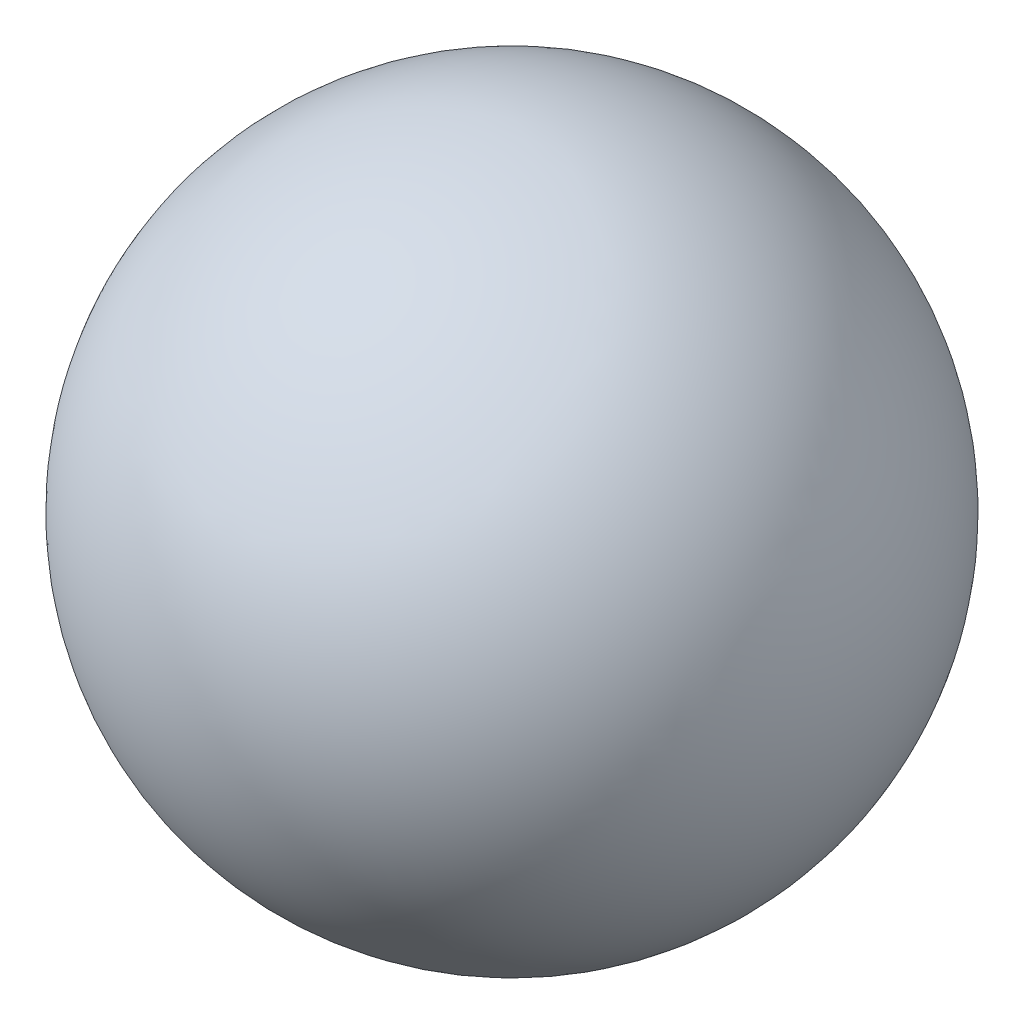
ISO-10303-21;
HEADER;
FILE_DESCRIPTION(('STEP AP214'),'2;1');
FILE_NAME('part.step','',(''),(''),'','','');
FILE_SCHEMA(('AUTOMOTIVE_DESIGN { 1 0 10303 214 1 1 1 1 }'));
ENDSEC;
DATA;
#1=APPLICATION_CONTEXT('core data for automotive mechanical design processes');
#2=APPLICATION_PROTOCOL_DEFINITION('international standard','automotive_design',2000,#1);
#3=PRODUCT_CONTEXT('',#1,'mechanical');
#4=PRODUCT('Part','Part','',(#3));
#5=PRODUCT_RELATED_PRODUCT_CATEGORY('part','',(#4));
#6=PRODUCT_DEFINITION_FORMATION('','',#4);
#7=PRODUCT_DEFINITION_CONTEXT('part definition',#1,'design');
#8=PRODUCT_DEFINITION('design','',#6,#7);
#9=PRODUCT_DEFINITION_SHAPE('','',#8);
#10=(LENGTH_UNIT() NAMED_UNIT(*) SI_UNIT(.MILLI.,.METRE.));
#11=(NAMED_UNIT(*) PLANE_ANGLE_UNIT() SI_UNIT($,.RADIAN.));
#12=(NAMED_UNIT(*) SI_UNIT($,.STERADIAN.) SOLID_ANGLE_UNIT());
#13=UNCERTAINTY_MEASURE_WITH_UNIT(LENGTH_MEASURE(1.E-05),#10,'distance_accuracy_value','');
#14=(GEOMETRIC_REPRESENTATION_CONTEXT(3) GLOBAL_UNCERTAINTY_ASSIGNED_CONTEXT((#13)) GLOBAL_UNIT_ASSIGNED_CONTEXT((#10,
#11,#12)) REPRESENTATION_CONTEXT('',''));
#15=CARTESIAN_POINT('',(0.,0.,0.));
#16=DIRECTION('',(0.,0.,1.));
#17=DIRECTION('',(1.,0.,0.));
#18=AXIS2_PLACEMENT_3D('',#15,#16,#17);
#19=CARTESIAN_POINT('',(0.,0.,0.));
#20=DIRECTION('',(1.,0.,0.));
#21=DIRECTION('',(0.,-1.,0.));
#22=AXIS2_PLACEMENT_3D('',#19,#20,#21);
#23=SPHERICAL_SURFACE('',#22,3.);
#24=CARTESIAN_POINT('',(-2.59807621135332,0.,0.));
#25=DIRECTION('',(1.,0.,0.));
#26=DIRECTION('',(0.,0.,-1.));
#27=AXIS2_PLACEMENT_3D('',#24,#25,#26);
#28=CIRCLE('',#27,1.5);
#29=CARTESIAN_POINT('',(-2.59807621135332,0.,-1.5));
#30=VERTEX_POINT('',#29);
#31=EDGE_CURVE('E11',#30,#30,#28,.T.);
#32=ORIENTED_EDGE('',*,*,#31,.T.);
#33=EDGE_LOOP('',(#32));
#34=FACE_BOUND('',#33,.T.);
#35=ADVANCED_FACE('F34',(#34),#23,.T.);
#36=CARTESIAN_POINT('',(0.,0.,0.));
#37=DIRECTION('',(1.,0.,0.));
#38=DIRECTION('',(0.,0.,-1.));
#39=AXIS2_PLACEMENT_3D('',#36,#37,#38);
#40=CYLINDRICAL_SURFACE('',#39,1.5);
#41=CARTESIAN_POINT('',(0.401923788646684,0.,0.));
#42=DIRECTION('',(1.,0.,0.));
#43=DIRECTION('',(0.,0.,-1.));
#44=AXIS2_PLACEMENT_3D('',#41,#42,#43);
#45=CIRCLE('',#44,1.5);
#46=CARTESIAN_POINT('',(0.401923788646684,0.,-1.5));
#47=VERTEX_POINT('',#46);
#48=EDGE_CURVE('E40',#47,#47,#45,.T.);
#49=ORIENTED_EDGE('',*,*,#48,.T.);
#50=EDGE_LOOP('',(#49));
#51=FACE_BOUND('',#50,.T.);
#52=ORIENTED_EDGE('',*,*,#31,.F.);
#53=EDGE_LOOP('',(#52));
#54=FACE_BOUND('',#53,.T.);
#55=ADVANCED_FACE('F46',(#51,#54),#40,.F.);
#56=CARTESIAN_POINT('',(0.401923788646684,0.,0.));
#57=DIRECTION('',(-1.,0.,0.));
#58=DIRECTION('',(0.,0.,1.));
#59=AXIS2_PLACEMENT_3D('',#56,#57,#58);
#60=CONICAL_SURFACE('',#59,1.5,1.08210413623649);
#61=CARTESIAN_POINT('',(1.1994879361389,0.,0.));
#62=VERTEX_POINT('',#61);
#63=VERTEX_LOOP('',#62);
#64=FACE_BOUND('',#63,.T.);
#65=ORIENTED_EDGE('',*,*,#48,.F.);
#66=EDGE_LOOP('',(#65));
#67=FACE_BOUND('',#66,.T.);
#68=ADVANCED_FACE('F43',(#64,#67),#60,.F.);
#69=CLOSED_SHELL('',(#35,#55,#68));
#70=MANIFOLD_SOLID_BREP('B2',#69);
#71=ADVANCED_BREP_SHAPE_REPRESENTATION('',(#18,#70),#14);
#72=SHAPE_DEFINITION_REPRESENTATION(#9,#71);
ENDSEC;
END-ISO-10303-21;
